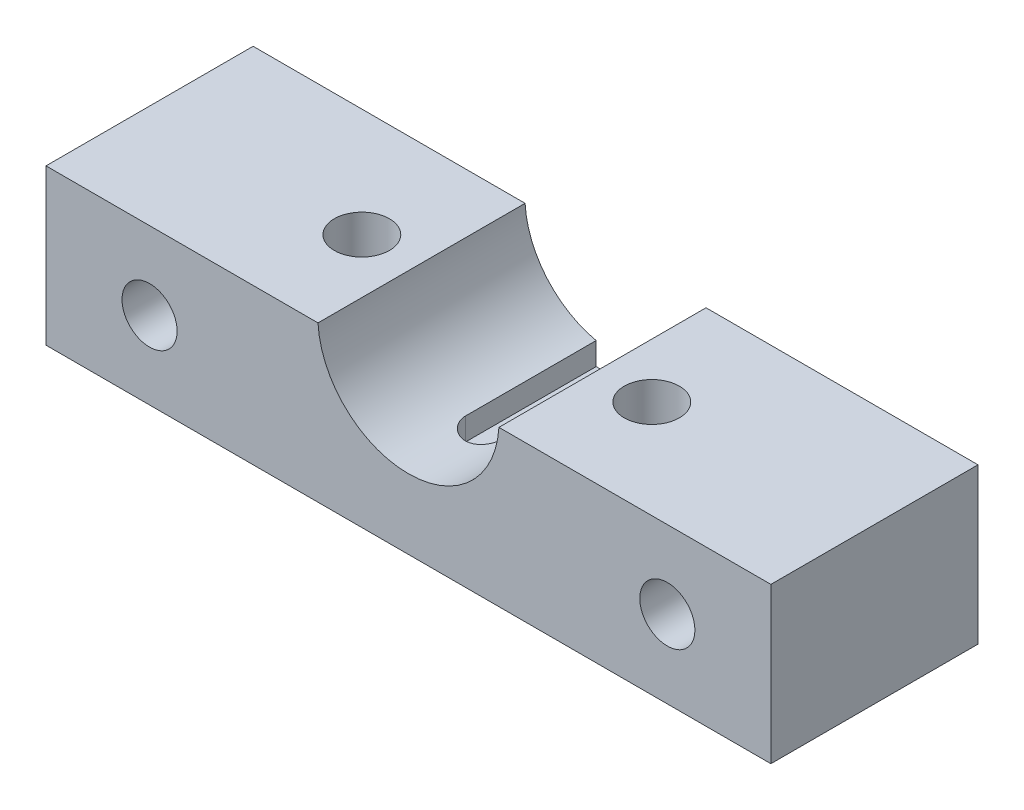
ISO-10303-21;
HEADER;
FILE_DESCRIPTION(('STEP AP214'),'2;1');
FILE_NAME('part.step','',(''),(''),'','','');
FILE_SCHEMA(('AUTOMOTIVE_DESIGN { 1 0 10303 214 1 1 1 1 }'));
ENDSEC;
DATA;
#1=APPLICATION_CONTEXT('core data for automotive mechanical design processes');
#2=APPLICATION_PROTOCOL_DEFINITION('international standard','automotive_design',2000,#1);
#3=PRODUCT_CONTEXT('',#1,'mechanical');
#4=PRODUCT('Part','Part','',(#3));
#5=PRODUCT_RELATED_PRODUCT_CATEGORY('part','',(#4));
#6=PRODUCT_DEFINITION_FORMATION('','',#4);
#7=PRODUCT_DEFINITION_CONTEXT('part definition',#1,'design');
#8=PRODUCT_DEFINITION('design','',#6,#7);
#9=PRODUCT_DEFINITION_SHAPE('','',#8);
#10=(LENGTH_UNIT() NAMED_UNIT(*) SI_UNIT(.MILLI.,.METRE.));
#11=(NAMED_UNIT(*) PLANE_ANGLE_UNIT() SI_UNIT($,.RADIAN.));
#12=(NAMED_UNIT(*) SI_UNIT($,.STERADIAN.) SOLID_ANGLE_UNIT());
#13=UNCERTAINTY_MEASURE_WITH_UNIT(LENGTH_MEASURE(1.E-05),#10,'distance_accuracy_value','');
#14=(GEOMETRIC_REPRESENTATION_CONTEXT(3) GLOBAL_UNCERTAINTY_ASSIGNED_CONTEXT((#13)) GLOBAL_UNIT_ASSIGNED_CONTEXT((#10,
#11,#12)) REPRESENTATION_CONTEXT('',''));
#15=CARTESIAN_POINT('',(0.,0.,0.));
#16=DIRECTION('',(0.,0.,1.));
#17=DIRECTION('',(1.,0.,0.));
#18=AXIS2_PLACEMENT_3D('',#15,#16,#17);
#19=CARTESIAN_POINT('',(0.,-19.685,34.925));
#20=DIRECTION('',(0.,-1.,0.));
#21=DIRECTION('',(1.,0.,0.));
#22=AXIS2_PLACEMENT_3D('',#19,#20,#21);
#23=PLANE('',#22);
#24=DIRECTION('',(-1.,0.,0.));
#25=VECTOR('',#24,1.);
#26=CARTESIAN_POINT('',(0.,-19.685,9.525));
#27=LINE('',#26,#25);
#28=CARTESIAN_POINT('',(44.45,-19.685,9.525));
#29=VERTEX_POINT('',#28);
#30=CARTESIAN_POINT('',(-44.45,-19.685,9.525));
#31=VERTEX_POINT('',#30);
#32=EDGE_CURVE('E177',#29,#31,#27,.T.);
#33=ORIENTED_EDGE('',*,*,#32,.F.);
#34=DIRECTION('',(0.,0.,-1.));
#35=VECTOR('',#34,1.);
#36=CARTESIAN_POINT('',(44.45,-19.685,34.925));
#37=LINE('',#36,#35);
#38=CARTESIAN_POINT('',(44.45,-19.685,34.925));
#39=VERTEX_POINT('',#38);
#40=EDGE_CURVE('E182',#39,#29,#37,.T.);
#41=ORIENTED_EDGE('',*,*,#40,.F.);
#42=DIRECTION('',(-1.,0.,0.));
#43=VECTOR('',#42,1.);
#44=CARTESIAN_POINT('',(0.,-19.685,34.925));
#45=LINE('',#44,#43);
#46=CARTESIAN_POINT('',(-44.45,-19.685,34.925));
#47=VERTEX_POINT('',#46);
#48=EDGE_CURVE('E186',#39,#47,#45,.T.);
#49=ORIENTED_EDGE('',*,*,#48,.T.);
#50=DIRECTION('',(0.,0.,-1.));
#51=VECTOR('',#50,1.);
#52=CARTESIAN_POINT('',(-44.45,-19.685,34.925));
#53=LINE('',#52,#51);
#54=EDGE_CURVE('E185',#47,#31,#53,.T.);
#55=ORIENTED_EDGE('',*,*,#54,.T.);
#56=EDGE_LOOP('',(#33,#41,#49,#55));
#57=FACE_BOUND('',#56,.T.);
#58=CARTESIAN_POINT('',(17.78,-19.685,22.86));
#59=DIRECTION('',(0.,-1.,0.));
#60=DIRECTION('',(1.,0.,0.));
#61=AXIS2_PLACEMENT_3D('',#58,#59,#60);
#62=CIRCLE('',#61,3.3782);
#63=CARTESIAN_POINT('',(21.1582,-19.685,22.86));
#64=VERTEX_POINT('',#63);
#65=EDGE_CURVE('E204',#64,#64,#62,.T.);
#66=ORIENTED_EDGE('',*,*,#65,.F.);
#67=EDGE_LOOP('',(#66));
#68=FACE_BOUND('',#67,.T.);
#69=CARTESIAN_POINT('',(-17.78,-19.685,22.86));
#70=DIRECTION('',(0.,-1.,0.));
#71=DIRECTION('',(1.,0.,0.));
#72=AXIS2_PLACEMENT_3D('',#69,#70,#71);
#73=CIRCLE('',#72,3.3782);
#74=CARTESIAN_POINT('',(-14.4018,-19.685,22.86));
#75=VERTEX_POINT('',#74);
#76=EDGE_CURVE('E209',#75,#75,#73,.F.);
#77=ORIENTED_EDGE('',*,*,#76,.T.);
#78=EDGE_LOOP('',(#77));
#79=FACE_BOUND('',#78,.T.);
#80=ADVANCED_FACE('F47',(#57,#68,#79),#23,.T.);
#81=CARTESIAN_POINT('',(0.,0.,34.925));
#82=DIRECTION('',(0.,0.,1.));
#83=DIRECTION('',(1.,0.,0.));
#84=AXIS2_PLACEMENT_3D('',#81,#82,#83);
#85=PLANE('',#84);
#86=CARTESIAN_POINT('',(-31.75,-10.16,34.925));
#87=DIRECTION('',(0.,0.,1.));
#88=DIRECTION('',(1.,0.,0.));
#89=AXIS2_PLACEMENT_3D('',#86,#87,#88);
#90=CIRCLE('',#89,3.3782);
#91=CARTESIAN_POINT('',(-28.3718,-10.16,34.925));
#92=VERTEX_POINT('',#91);
#93=EDGE_CURVE('E336',#92,#92,#90,.T.);
#94=ORIENTED_EDGE('',*,*,#93,.F.);
#95=EDGE_LOOP('',(#94));
#96=FACE_BOUND('',#95,.T.);
#97=DIRECTION('',(0.,1.,0.));
#98=VECTOR('',#97,1.);
#99=CARTESIAN_POINT('',(44.45,0.,34.925));
#100=LINE('',#99,#98);
#101=CARTESIAN_POINT('',(44.45,-0.634999999999989,34.925));
#102=VERTEX_POINT('',#101);
#103=EDGE_CURVE('E181',#39,#102,#100,.T.);
#104=ORIENTED_EDGE('',*,*,#103,.T.);
#105=DIRECTION('',(-1.,0.,0.));
#106=VECTOR('',#105,1.);
#107=CARTESIAN_POINT('',(0.,-0.635000000000004,34.925));
#108=LINE('',#107,#106);
#109=CARTESIAN_POINT('',(11.0943423081317,-0.635000000000007,34.925));
#110=VERTEX_POINT('',#109);
#111=EDGE_CURVE('E346',#102,#110,#108,.T.);
#112=ORIENTED_EDGE('',*,*,#111,.T.);
#113=CARTESIAN_POINT('',(0.,0.,34.925));
#114=DIRECTION('',(0.,0.,1.));
#115=DIRECTION('',(1.,0.,0.));
#116=AXIS2_PLACEMENT_3D('',#113,#114,#115);
#117=CIRCLE('',#116,11.1125);
#118=CARTESIAN_POINT('',(-11.0943423081317,-0.635,34.925));
#119=VERTEX_POINT('',#118);
#120=EDGE_CURVE('E349',#119,#110,#117,.T.);
#121=ORIENTED_EDGE('',*,*,#120,.F.);
#122=DIRECTION('',(1.,0.,0.));
#123=VECTOR('',#122,1.);
#124=CARTESIAN_POINT('',(0.,-0.635,34.925));
#125=LINE('',#124,#123);
#126=CARTESIAN_POINT('',(-44.45,-0.635,34.925));
#127=VERTEX_POINT('',#126);
#128=EDGE_CURVE('E352',#127,#119,#125,.T.);
#129=ORIENTED_EDGE('',*,*,#128,.F.);
#130=DIRECTION('',(0.,1.,0.));
#131=VECTOR('',#130,1.);
#132=CARTESIAN_POINT('',(-44.45,0.,34.925));
#133=LINE('',#132,#131);
#134=EDGE_CURVE('E356',#47,#127,#133,.T.);
#135=ORIENTED_EDGE('',*,*,#134,.F.);
#136=ORIENTED_EDGE('',*,*,#48,.F.);
#137=EDGE_LOOP('',(#104,#112,#121,#129,#135,#136));
#138=FACE_BOUND('',#137,.T.);
#139=CARTESIAN_POINT('',(31.75,-10.16,34.925));
#140=DIRECTION('',(0.,0.,1.));
#141=DIRECTION('',(1.,0.,0.));
#142=AXIS2_PLACEMENT_3D('',#139,#140,#141);
#143=CIRCLE('',#142,3.3782);
#144=CARTESIAN_POINT('',(35.1282,-10.16,34.925));
#145=VERTEX_POINT('',#144);
#146=EDGE_CURVE('E328',#145,#145,#143,.T.);
#147=ORIENTED_EDGE('',*,*,#146,.F.);
#148=EDGE_LOOP('',(#147));
#149=FACE_BOUND('',#148,.T.);
#150=ADVANCED_FACE('F254',(#96,#138,#149),#85,.T.);
#151=CARTESIAN_POINT('',(0.,0.,9.525));
#152=DIRECTION('',(0.,0.,1.));
#153=DIRECTION('',(1.,0.,0.));
#154=AXIS2_PLACEMENT_3D('',#151,#152,#153);
#155=PLANE('',#154);
#156=CARTESIAN_POINT('',(0.,0.,9.525));
#157=DIRECTION('',(0.,0.,1.));
#158=DIRECTION('',(1.,0.,0.));
#159=AXIS2_PLACEMENT_3D('',#156,#157,#158);
#160=CIRCLE('',#159,11.1125);
#161=CARTESIAN_POINT('',(-11.0943423081317,-0.635,9.525));
#162=VERTEX_POINT('',#161);
#163=CARTESIAN_POINT('',(-2.38124999999999,-10.854368000372,9.525));
#164=VERTEX_POINT('',#163);
#165=EDGE_CURVE('E160',#162,#164,#160,.T.);
#166=ORIENTED_EDGE('',*,*,#165,.T.);
#167=DIRECTION('',(0.,-1.,0.));
#168=VECTOR('',#167,1.);
#169=CARTESIAN_POINT('',(-2.38125000000001,0.,9.525));
#170=LINE('',#169,#168);
#171=CARTESIAN_POINT('',(-2.38124999999999,-13.62075,9.525));
#172=VERTEX_POINT('',#171);
#173=EDGE_CURVE('E151',#164,#172,#170,.T.);
#174=ORIENTED_EDGE('',*,*,#173,.T.);
#175=DIRECTION('',(1.,0.,0.));
#176=VECTOR('',#175,1.);
#177=CARTESIAN_POINT('',(0.,-13.62075,9.525));
#178=LINE('',#177,#176);
#179=CARTESIAN_POINT('',(2.38125000000001,-13.62075,9.525));
#180=VERTEX_POINT('',#179);
#181=EDGE_CURVE('E149',#172,#180,#178,.T.);
#182=ORIENTED_EDGE('',*,*,#181,.T.);
#183=DIRECTION('',(0.,1.,0.));
#184=VECTOR('',#183,1.);
#185=CARTESIAN_POINT('',(2.38125,0.,9.525));
#186=LINE('',#185,#184);
#187=CARTESIAN_POINT('',(2.38125000000001,-10.854368000372,9.525));
#188=VERTEX_POINT('',#187);
#189=EDGE_CURVE('E132',#180,#188,#186,.T.);
#190=ORIENTED_EDGE('',*,*,#189,.T.);
#191=CARTESIAN_POINT('',(11.0943423081317,-0.635000000000007,9.525));
#192=VERTEX_POINT('',#191);
#193=EDGE_CURVE('E145',#188,#192,#160,.T.);
#194=ORIENTED_EDGE('',*,*,#193,.T.);
#195=DIRECTION('',(-1.,0.,0.));
#196=VECTOR('',#195,1.);
#197=CARTESIAN_POINT('',(0.,-0.635000000000004,9.525));
#198=LINE('',#197,#196);
#199=CARTESIAN_POINT('',(44.45,-0.634999999999989,9.525));
#200=VERTEX_POINT('',#199);
#201=EDGE_CURVE('E161',#200,#192,#198,.T.);
#202=ORIENTED_EDGE('',*,*,#201,.F.);
#203=DIRECTION('',(0.,1.,0.));
#204=VECTOR('',#203,1.);
#205=CARTESIAN_POINT('',(44.45,0.,9.525));
#206=LINE('',#205,#204);
#207=EDGE_CURVE('E166',#29,#200,#206,.T.);
#208=ORIENTED_EDGE('',*,*,#207,.F.);
#209=ORIENTED_EDGE('',*,*,#32,.T.);
#210=DIRECTION('',(0.,1.,0.));
#211=VECTOR('',#210,1.);
#212=CARTESIAN_POINT('',(-44.45,0.,9.525));
#213=LINE('',#212,#211);
#214=CARTESIAN_POINT('',(-44.45,-0.635,9.525));
#215=VERTEX_POINT('',#214);
#216=EDGE_CURVE('E173',#31,#215,#213,.T.);
#217=ORIENTED_EDGE('',*,*,#216,.T.);
#218=DIRECTION('',(1.,0.,0.));
#219=VECTOR('',#218,1.);
#220=CARTESIAN_POINT('',(0.,-0.635,9.525));
#221=LINE('',#220,#219);
#222=EDGE_CURVE('E165',#215,#162,#221,.T.);
#223=ORIENTED_EDGE('',*,*,#222,.T.);
#224=EDGE_LOOP('',(#166,#174,#182,#190,#194,#202,#208,#209,#217,#223));
#225=FACE_BOUND('',#224,.T.);
#226=CARTESIAN_POINT('',(-31.75,-10.16,9.525));
#227=DIRECTION('',(0.,0.,1.));
#228=DIRECTION('',(1.,0.,0.));
#229=AXIS2_PLACEMENT_3D('',#226,#227,#228);
#230=CIRCLE('',#229,3.3782);
#231=CARTESIAN_POINT('',(-28.3718,-10.16,9.525));
#232=VERTEX_POINT('',#231);
#233=EDGE_CURVE('E332',#232,#232,#230,.T.);
#234=ORIENTED_EDGE('',*,*,#233,.T.);
#235=EDGE_LOOP('',(#234));
#236=FACE_BOUND('',#235,.T.);
#237=CARTESIAN_POINT('',(31.75,-10.16,9.525));
#238=DIRECTION('',(0.,0.,1.));
#239=DIRECTION('',(1.,0.,0.));
#240=AXIS2_PLACEMENT_3D('',#237,#238,#239);
#241=CIRCLE('',#240,3.3782);
#242=CARTESIAN_POINT('',(35.1282,-10.16,9.525));
#243=VERTEX_POINT('',#242);
#244=EDGE_CURVE('E327',#243,#243,#241,.T.);
#245=ORIENTED_EDGE('',*,*,#244,.T.);
#246=EDGE_LOOP('',(#245));
#247=FACE_BOUND('',#246,.T.);
#248=ADVANCED_FACE('F143',(#225,#236,#247),#155,.F.);
#249=CARTESIAN_POINT('',(44.45,0.,34.925));
#250=DIRECTION('',(-1.,0.,0.));
#251=DIRECTION('',(0.,0.,1.));
#252=AXIS2_PLACEMENT_3D('',#249,#250,#251);
#253=PLANE('',#252);
#254=ORIENTED_EDGE('',*,*,#207,.T.);
#255=DIRECTION('',(0.,0.,-1.));
#256=VECTOR('',#255,1.);
#257=CARTESIAN_POINT('',(44.45,-0.634999999999989,34.925));
#258=LINE('',#257,#256);
#259=EDGE_CURVE('E197',#102,#200,#258,.T.);
#260=ORIENTED_EDGE('',*,*,#259,.F.);
#261=ORIENTED_EDGE('',*,*,#103,.F.);
#262=ORIENTED_EDGE('',*,*,#40,.T.);
#263=EDGE_LOOP('',(#254,#260,#261,#262));
#264=FACE_BOUND('',#263,.T.);
#265=ADVANCED_FACE('F245',(#264),#253,.F.);
#266=CARTESIAN_POINT('',(0.,-0.635000000000004,34.925));
#267=DIRECTION('',(0.,-1.,0.));
#268=DIRECTION('',(1.,0.,0.));
#269=AXIS2_PLACEMENT_3D('',#266,#267,#268);
#270=PLANE('',#269);
#271=CARTESIAN_POINT('',(17.78,-0.634999999999997,22.86));
#272=DIRECTION('',(0.,-1.,0.));
#273=DIRECTION('',(1.,0.,0.));
#274=AXIS2_PLACEMENT_3D('',#271,#272,#273);
#275=CIRCLE('',#274,3.3782);
#276=CARTESIAN_POINT('',(21.1582,-0.634999999999996,22.86));
#277=VERTEX_POINT('',#276);
#278=EDGE_CURVE('E208',#277,#277,#275,.T.);
#279=ORIENTED_EDGE('',*,*,#278,.T.);
#280=EDGE_LOOP('',(#279));
#281=FACE_BOUND('',#280,.T.);
#282=ORIENTED_EDGE('',*,*,#201,.T.);
#283=DIRECTION('',(0.,0.,-1.));
#284=VECTOR('',#283,1.);
#285=CARTESIAN_POINT('',(11.0943423081317,-0.635000000000007,34.925));
#286=LINE('',#285,#284);
#287=EDGE_CURVE('E157',#110,#192,#286,.T.);
#288=ORIENTED_EDGE('',*,*,#287,.F.);
#289=ORIENTED_EDGE('',*,*,#111,.F.);
#290=ORIENTED_EDGE('',*,*,#259,.T.);
#291=EDGE_LOOP('',(#282,#288,#289,#290));
#292=FACE_BOUND('',#291,.T.);
#293=ADVANCED_FACE('F241',(#281,#292),#270,.F.);
#294=CARTESIAN_POINT('',(0.,0.,34.925));
#295=DIRECTION('',(0.,0.,-1.));
#296=DIRECTION('',(-1.,0.,0.));
#297=AXIS2_PLACEMENT_3D('',#294,#295,#296);
#298=CYLINDRICAL_SURFACE('',#297,11.1125);
#299=CARTESIAN_POINT('',(2.38125000000001,-10.854368000372,25.55875));
#300=CARTESIAN_POINT('',(2.38125731029288,-10.8543618083452,25.6249052313647));
#301=CARTESIAN_POINT('',(2.37849323153026,-10.8549726686914,25.6910563472308));
#302=CARTESIAN_POINT('',(2.36747901541211,-10.8573826259014,25.8228697918288));
#303=CARTESIAN_POINT('',(2.35922962083524,-10.8591815618851,25.8885321855226));
#304=CARTESIAN_POINT('',(2.33732011782288,-10.8639177928308,26.0187948927667));
#305=CARTESIAN_POINT('',(2.32366923874024,-10.8668531458479,26.0833968232145));
#306=CARTESIAN_POINT('',(2.29107920168039,-10.8737706224298,26.2111771259139));
#307=CARTESIAN_POINT('',(2.27214000918637,-10.8777527528269,26.274355488871));
#308=CARTESIAN_POINT('',(2.20758248764443,-10.8911062462534,26.4611021472623));
#309=CARTESIAN_POINT('',(2.15420588034613,-10.9018889280778,26.5819901362515));
#310=CARTESIAN_POINT('',(2.02840006084028,-10.925993070211,26.8130554289752));
#311=CARTESIAN_POINT('',(1.95596751960317,-10.9393149740041,26.9232308566384));
#312=CARTESIAN_POINT('',(1.79285162985098,-10.9672361222124,27.1315747945938));
#313=CARTESIAN_POINT('',(1.70192046579961,-10.981850999203,27.2295475372086));
#314=CARTESIAN_POINT('',(1.50491233133205,-11.0105760705079,27.4089792537758));
#315=CARTESIAN_POINT('',(1.3988325071393,-11.0246861691019,27.4904351091858));
#316=CARTESIAN_POINT('',(1.17320626983486,-11.0509846611919,27.6353094828378));
#317=CARTESIAN_POINT('',(1.05353213465334,-11.0631517111739,27.6985331024775));
#318=CARTESIAN_POINT('',(0.804983142692555,-11.0840049029696,27.8038645305007));
#319=CARTESIAN_POINT('',(0.676114986037952,-11.0926935497425,27.8459875399225));
#320=CARTESIAN_POINT('',(0.455440706182709,-11.1035222770726,27.8978361618829));
#321=CARTESIAN_POINT('',(0.365072497846721,-11.1068703359535,27.9136274358391));
#322=CARTESIAN_POINT('',(0.183151109667501,-11.1113671214621,27.9347136203815));
#323=CARTESIAN_POINT('',(0.0915990929806456,-11.1125178629516,27.9400181470998));
#324=CARTESIAN_POINT('',(0.,-11.1125,27.94));
#325=B_SPLINE_CURVE_WITH_KNOTS('',3,(#299,#300,#301,#302,#303,#304,#305,#306,#307,#308,#309,
#310,#311,#312,#313,#314,#315,#316,#317,#318,#319,#320,#321,#322,#323,#324),.UNSPECIFIED.,.F.,
.F.,(4,2,2,2,2,2,2,2,2,2,2,2,4),(0.,0.198397990447355,0.396769120856834,0.594802754141476,
0.792837680021285,1.18858242799952,1.58439635767228,1.98591058393143,2.38750054937456,
2.79323651257426,3.19867975865139,3.47347920358404,3.74802654596497),.UNSPECIFIED.);
#326=CARTESIAN_POINT('',(2.38125000000001,-10.854368000372,25.55875));
#327=VERTEX_POINT('',#326);
#328=CARTESIAN_POINT('',(0.,-11.1125,27.94));
#329=VERTEX_POINT('',#328);
#330=EDGE_CURVE('E58',#327,#329,#325,.T.);
#331=ORIENTED_EDGE('',*,*,#330,.T.);
#332=CARTESIAN_POINT('',(0.,-11.1125,27.94));
#333=CARTESIAN_POINT('',(-0.0661728880134317,-11.1125056554506,27.9400072682973));
#334=CARTESIAN_POINT('',(-0.132341759246078,-11.1119090536825,27.93724175568));
#335=CARTESIAN_POINT('',(-0.264191716651261,-11.1095532341843,27.9262215242901));
#336=CARTESIAN_POINT('',(-0.329872864415999,-11.1077941658712,27.9179675109775));
#337=CARTESIAN_POINT('',(-0.460176626707505,-11.1031591421649,27.8960448187712));
#338=CARTESIAN_POINT('',(-0.5248008174679,-11.1002850457309,27.8823851513519));
#339=CARTESIAN_POINT('',(-0.652625928579859,-11.0935044292074,27.8497732875526));
#340=CARTESIAN_POINT('',(-0.715826842049215,-11.0895979041269,27.8308210655865));
#341=CARTESIAN_POINT('',(-0.902644527893435,-11.0764797715718,27.7662162707137));
#342=CARTESIAN_POINT('',(-1.0235802365462,-11.0658656580903,27.7127979321786));
#343=CARTESIAN_POINT('',(-1.25472444720257,-11.0420504079918,27.586894558325));
#344=CARTESIAN_POINT('',(-1.36493128544992,-11.0288488710893,27.5144065722546));
#345=CARTESIAN_POINT('',(-1.57324011798414,-11.0010802236588,27.3512340312176));
#346=CARTESIAN_POINT('',(-1.67115593698971,-10.9864969055312,27.2603141592566));
#347=CARTESIAN_POINT('',(-1.85047776136351,-10.9577214929547,27.0633521412499));
#348=CARTESIAN_POINT('',(-1.93188036791156,-10.9435294795642,26.9573068896677));
#349=CARTESIAN_POINT('',(-2.07669740458774,-10.9169812706528,26.7317126244294));
#350=CARTESIAN_POINT('',(-2.13990758076635,-10.9046466101441,26.6120298628955));
#351=CARTESIAN_POINT('',(-2.24521116475204,-10.8834546967296,26.3634636452676));
#352=CARTESIAN_POINT('',(-2.28732017618359,-10.8745948753502,26.2345870685029));
#353=CARTESIAN_POINT('',(-2.33913067634615,-10.8635438947306,26.0139510634761));
#354=CARTESIAN_POINT('',(-2.35490483814162,-10.8601234147068,25.9236327671063));
#355=CARTESIAN_POINT('',(-2.37596897696094,-10.855526658365,25.7418080772608));
#356=CARTESIAN_POINT('',(-2.38126823890859,-10.8543483945869,25.6503028084112));
#357=CARTESIAN_POINT('',(-2.38124999999999,-10.854368000372,25.55875));
#358=B_SPLINE_CURVE_WITH_KNOTS('',3,(#332,#333,#334,#335,#336,#337,#338,#339,#340,#341,#342,
#343,#344,#345,#346,#347,#348,#349,#350,#351,#352,#353,#354,#355,#356,#357),.UNSPECIFIED.,.F.,
.F.,(4,2,2,2,2,2,2,2,2,2,2,2,4),(0.,0.198451202985719,0.396876903129208,0.594973202581335,
0.793070459715743,1.18895230918271,1.58489545170305,1.98625396103871,2.38769499607342,
2.79348149070545,3.1989674749952,3.47361866297639,3.74802629149828),.UNSPECIFIED.);
#359=CARTESIAN_POINT('',(-2.38124999999999,-10.854368000372,25.55875));
#360=VERTEX_POINT('',#359);
#361=EDGE_CURVE('E11',#329,#360,#358,.T.);
#362=ORIENTED_EDGE('',*,*,#361,.T.);
#363=DIRECTION('',(0.,0.,-1.));
#364=VECTOR('',#363,1.);
#365=CARTESIAN_POINT('',(-2.38124999999999,-10.854368000372,27.94));
#366=LINE('',#365,#364);
#367=EDGE_CURVE('E152',#360,#164,#366,.T.);
#368=ORIENTED_EDGE('',*,*,#367,.T.);
#369=ORIENTED_EDGE('',*,*,#165,.F.);
#370=DIRECTION('',(0.,0.,-1.));
#371=VECTOR('',#370,1.);
#372=CARTESIAN_POINT('',(-11.0943423081317,-0.635,34.925));
#373=LINE('',#372,#371);
#374=EDGE_CURVE('E192',#119,#162,#373,.T.);
#375=ORIENTED_EDGE('',*,*,#374,.F.);
#376=ORIENTED_EDGE('',*,*,#120,.T.);
#377=ORIENTED_EDGE('',*,*,#287,.T.);
#378=ORIENTED_EDGE('',*,*,#193,.F.);
#379=DIRECTION('',(0.,0.,-1.));
#380=VECTOR('',#379,1.);
#381=CARTESIAN_POINT('',(2.38125000000001,-10.854368000372,27.94));
#382=LINE('',#381,#380);
#383=EDGE_CURVE('E128',#327,#188,#382,.T.);
#384=ORIENTED_EDGE('',*,*,#383,.F.);
#385=EDGE_LOOP('',(#331,#362,#368,#369,#375,#376,#377,#378,#384));
#386=FACE_BOUND('',#385,.T.);
#387=ADVANCED_FACE('F154',(#386),#298,.F.);
#388=CARTESIAN_POINT('',(0.,-0.635,34.925));
#389=DIRECTION('',(0.,1.,0.));
#390=DIRECTION('',(0.,0.,1.));
#391=AXIS2_PLACEMENT_3D('',#388,#389,#390);
#392=PLANE('',#391);
#393=CARTESIAN_POINT('',(-17.78,-0.634999999999997,22.86));
#394=DIRECTION('',(0.,1.,0.));
#395=DIRECTION('',(0.,0.,1.));
#396=AXIS2_PLACEMENT_3D('',#393,#394,#395);
#397=CIRCLE('',#396,3.3782);
#398=CARTESIAN_POINT('',(-17.78,-0.634999999999997,26.2382));
#399=VERTEX_POINT('',#398);
#400=EDGE_CURVE('E139',#399,#399,#397,.F.);
#401=ORIENTED_EDGE('',*,*,#400,.T.);
#402=EDGE_LOOP('',(#401));
#403=FACE_BOUND('',#402,.T.);
#404=ORIENTED_EDGE('',*,*,#222,.F.);
#405=DIRECTION('',(0.,0.,-1.));
#406=VECTOR('',#405,1.);
#407=CARTESIAN_POINT('',(-44.45,-0.635,34.925));
#408=LINE('',#407,#406);
#409=EDGE_CURVE('E189',#127,#215,#408,.T.);
#410=ORIENTED_EDGE('',*,*,#409,.F.);
#411=ORIENTED_EDGE('',*,*,#128,.T.);
#412=ORIENTED_EDGE('',*,*,#374,.T.);
#413=EDGE_LOOP('',(#404,#410,#411,#412));
#414=FACE_BOUND('',#413,.T.);
#415=ADVANCED_FACE('F240',(#403,#414),#392,.T.);
#416=CARTESIAN_POINT('',(-31.75,-10.16,34.925));
#417=DIRECTION('',(0.,0.,-1.));
#418=DIRECTION('',(-1.,0.,0.));
#419=AXIS2_PLACEMENT_3D('',#416,#417,#418);
#420=CYLINDRICAL_SURFACE('',#419,3.3782);
#421=ORIENTED_EDGE('',*,*,#93,.T.);
#422=EDGE_LOOP('',(#421));
#423=FACE_BOUND('',#422,.T.);
#424=ORIENTED_EDGE('',*,*,#233,.F.);
#425=EDGE_LOOP('',(#424));
#426=FACE_BOUND('',#425,.T.);
#427=ADVANCED_FACE('F278',(#423,#426),#420,.F.);
#428=CARTESIAN_POINT('',(31.75,-10.16,34.925));
#429=DIRECTION('',(0.,0.,-1.));
#430=DIRECTION('',(-1.,0.,0.));
#431=AXIS2_PLACEMENT_3D('',#428,#429,#430);
#432=CYLINDRICAL_SURFACE('',#431,3.3782);
#433=ORIENTED_EDGE('',*,*,#146,.T.);
#434=EDGE_LOOP('',(#433));
#435=FACE_BOUND('',#434,.T.);
#436=ORIENTED_EDGE('',*,*,#244,.F.);
#437=EDGE_LOOP('',(#436));
#438=FACE_BOUND('',#437,.T.);
#439=ADVANCED_FACE('F281',(#435,#438),#432,.F.);
#440=CARTESIAN_POINT('',(0.,-13.62075,27.94));
#441=DIRECTION('',(0.,-1.,0.));
#442=DIRECTION('',(0.,0.,-1.));
#443=AXIS2_PLACEMENT_3D('',#440,#441,#442);
#444=PLANE('',#443);
#445=CARTESIAN_POINT('',(0.,-13.62075,25.55875));
#446=DIRECTION('',(0.,-1.,0.));
#447=DIRECTION('',(0.,0.,-1.));
#448=AXIS2_PLACEMENT_3D('',#445,#446,#447);
#449=CIRCLE('',#448,2.38125);
#450=CARTESIAN_POINT('',(-2.38124999999999,-13.62075,25.55875));
#451=VERTEX_POINT('',#450);
#452=CARTESIAN_POINT('',(0.,-13.62075,27.94));
#453=VERTEX_POINT('',#452);
#454=EDGE_CURVE('E203',#451,#453,#449,.F.);
#455=ORIENTED_EDGE('',*,*,#454,.T.);
#456=CARTESIAN_POINT('',(0.,-13.62075,25.55875));
#457=DIRECTION('',(0.,-1.,0.));
#458=DIRECTION('',(0.,0.,-1.));
#459=AXIS2_PLACEMENT_3D('',#456,#457,#458);
#460=CIRCLE('',#459,2.38125);
#461=CARTESIAN_POINT('',(2.38125000000001,-13.62075,25.55875));
#462=VERTEX_POINT('',#461);
#463=EDGE_CURVE('E215',#453,#462,#460,.F.);
#464=ORIENTED_EDGE('',*,*,#463,.T.);
#465=DIRECTION('',(0.,0.,-1.));
#466=VECTOR('',#465,1.);
#467=CARTESIAN_POINT('',(2.38125000000001,-13.62075,27.94));
#468=LINE('',#467,#466);
#469=EDGE_CURVE('E138',#462,#180,#468,.T.);
#470=ORIENTED_EDGE('',*,*,#469,.T.);
#471=ORIENTED_EDGE('',*,*,#181,.F.);
#472=DIRECTION('',(0.,0.,-1.));
#473=VECTOR('',#472,1.);
#474=CARTESIAN_POINT('',(-2.38124999999999,-13.62075,27.94));
#475=LINE('',#474,#473);
#476=EDGE_CURVE('E320',#451,#172,#475,.T.);
#477=ORIENTED_EDGE('',*,*,#476,.F.);
#478=EDGE_LOOP('',(#455,#464,#470,#471,#477));
#479=FACE_BOUND('',#478,.T.);
#480=ADVANCED_FACE('F285',(#479),#444,.F.);
#481=CARTESIAN_POINT('',(-2.38125000000001,0.,27.94));
#482=DIRECTION('',(-1.,0.,0.));
#483=DIRECTION('',(0.,-1.,0.));
#484=AXIS2_PLACEMENT_3D('',#481,#482,#483);
#485=PLANE('',#484);
#486=ORIENTED_EDGE('',*,*,#367,.F.);
#487=DIRECTION('',(0.,1.,0.));
#488=VECTOR('',#487,1.);
#489=CARTESIAN_POINT('',(-2.38124999999999,-13.62075,25.55875));
#490=LINE('',#489,#488);
#491=EDGE_CURVE('E220',#360,#451,#490,.F.);
#492=ORIENTED_EDGE('',*,*,#491,.T.);
#493=ORIENTED_EDGE('',*,*,#476,.T.);
#494=ORIENTED_EDGE('',*,*,#173,.F.);
#495=EDGE_LOOP('',(#486,#492,#493,#494));
#496=FACE_BOUND('',#495,.T.);
#497=ADVANCED_FACE('F287',(#496),#485,.F.);
#498=CARTESIAN_POINT('',(2.38125,0.,27.94));
#499=DIRECTION('',(1.,0.,0.));
#500=DIRECTION('',(0.,1.,0.));
#501=AXIS2_PLACEMENT_3D('',#498,#499,#500);
#502=PLANE('',#501);
#503=ORIENTED_EDGE('',*,*,#469,.F.);
#504=DIRECTION('',(0.,-1.,0.));
#505=VECTOR('',#504,1.);
#506=CARTESIAN_POINT('',(2.38125000000001,-10.854368000372,25.55875));
#507=LINE('',#506,#505);
#508=EDGE_CURVE('E135',#462,#327,#507,.F.);
#509=ORIENTED_EDGE('',*,*,#508,.T.);
#510=ORIENTED_EDGE('',*,*,#383,.T.);
#511=ORIENTED_EDGE('',*,*,#189,.F.);
#512=EDGE_LOOP('',(#503,#509,#510,#511));
#513=FACE_BOUND('',#512,.T.);
#514=ADVANCED_FACE('F131',(#513),#502,.F.);
#515=CARTESIAN_POINT('',(17.78,-44.45,22.86));
#516=DIRECTION('',(0.,1.,0.));
#517=DIRECTION('',(0.,0.,1.));
#518=AXIS2_PLACEMENT_3D('',#515,#516,#517);
#519=CYLINDRICAL_SURFACE('',#518,3.3782);
#520=ORIENTED_EDGE('',*,*,#65,.T.);
#521=EDGE_LOOP('',(#520));
#522=FACE_BOUND('',#521,.T.);
#523=ORIENTED_EDGE('',*,*,#278,.F.);
#524=EDGE_LOOP('',(#523));
#525=FACE_BOUND('',#524,.T.);
#526=ADVANCED_FACE('F296',(#522,#525),#519,.F.);
#527=CARTESIAN_POINT('',(-17.78,-44.45,22.86));
#528=DIRECTION('',(0.,1.,0.));
#529=DIRECTION('',(0.,0.,1.));
#530=AXIS2_PLACEMENT_3D('',#527,#528,#529);
#531=CYLINDRICAL_SURFACE('',#530,3.3782);
#532=ORIENTED_EDGE('',*,*,#400,.F.);
#533=EDGE_LOOP('',(#532));
#534=FACE_BOUND('',#533,.T.);
#535=ORIENTED_EDGE('',*,*,#76,.F.);
#536=EDGE_LOOP('',(#535));
#537=FACE_BOUND('',#536,.T.);
#538=ADVANCED_FACE('F299',(#534,#537),#531,.F.);
#539=CARTESIAN_POINT('',(0.,0.,25.55875));
#540=DIRECTION('',(0.,-1.,0.));
#541=DIRECTION('',(1.,0.,0.));
#542=AXIS2_PLACEMENT_3D('',#539,#540,#541);
#543=CYLINDRICAL_SURFACE('',#542,2.38125);
#544=ORIENTED_EDGE('',*,*,#491,.F.);
#545=ORIENTED_EDGE('',*,*,#361,.F.);
#546=DIRECTION('',(0.,1.,0.));
#547=VECTOR('',#546,1.);
#548=CARTESIAN_POINT('',(0.,-10.854368000372,27.94));
#549=LINE('',#548,#547);
#550=EDGE_CURVE('E52',#453,#329,#549,.T.);
#551=ORIENTED_EDGE('',*,*,#550,.F.);
#552=ORIENTED_EDGE('',*,*,#454,.F.);
#553=EDGE_LOOP('',(#544,#545,#551,#552));
#554=FACE_BOUND('',#553,.T.);
#555=ADVANCED_FACE('F49',(#554),#543,.F.);
#556=CARTESIAN_POINT('',(0.,0.,25.55875));
#557=DIRECTION('',(0.,1.,0.));
#558=DIRECTION('',(-1.,0.,0.));
#559=AXIS2_PLACEMENT_3D('',#556,#557,#558);
#560=CYLINDRICAL_SURFACE('',#559,2.38125);
#561=ORIENTED_EDGE('',*,*,#330,.F.);
#562=ORIENTED_EDGE('',*,*,#508,.F.);
#563=ORIENTED_EDGE('',*,*,#463,.F.);
#564=ORIENTED_EDGE('',*,*,#550,.T.);
#565=EDGE_LOOP('',(#561,#562,#563,#564));
#566=FACE_BOUND('',#565,.T.);
#567=ADVANCED_FACE('F233',(#566),#560,.F.);
#568=CARTESIAN_POINT('',(-44.45,0.,34.925));
#569=DIRECTION('',(-1.,0.,0.));
#570=DIRECTION('',(0.,0.,1.));
#571=AXIS2_PLACEMENT_3D('',#568,#569,#570);
#572=PLANE('',#571);
#573=ORIENTED_EDGE('',*,*,#216,.F.);
#574=ORIENTED_EDGE('',*,*,#54,.F.);
#575=ORIENTED_EDGE('',*,*,#134,.T.);
#576=ORIENTED_EDGE('',*,*,#409,.T.);
#577=EDGE_LOOP('',(#573,#574,#575,#576));
#578=FACE_BOUND('',#577,.T.);
#579=ADVANCED_FACE('F257',(#578),#572,.T.);
#580=CLOSED_SHELL('',(#80,#150,#248,#265,#293,#387,#415,#427,#439,#480,#497,#514,#526,#538,#555,
#567,#579));
#581=MANIFOLD_SOLID_BREP('B2',#580);
#582=ADVANCED_BREP_SHAPE_REPRESENTATION('',(#18,#581),#14);
#583=SHAPE_DEFINITION_REPRESENTATION(#9,#582);
ENDSEC;
END-ISO-10303-21;
